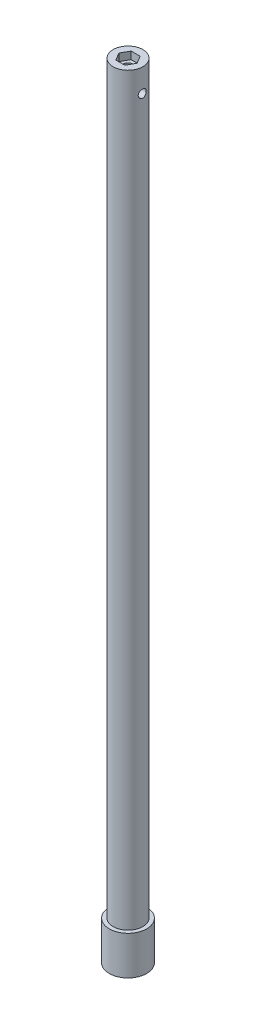
ISO-10303-21;
HEADER;
FILE_DESCRIPTION(('STEP AP214'),'2;1');
FILE_NAME('part.step','',(''),(''),'','','');
FILE_SCHEMA(('AUTOMOTIVE_DESIGN { 1 0 10303 214 1 1 1 1 }'));
ENDSEC;
DATA;
#1=APPLICATION_CONTEXT('core data for automotive mechanical design processes');
#2=APPLICATION_PROTOCOL_DEFINITION('international standard','automotive_design',2000,#1);
#3=PRODUCT_CONTEXT('',#1,'mechanical');
#4=PRODUCT('Part','Part','',(#3));
#5=PRODUCT_RELATED_PRODUCT_CATEGORY('part','',(#4));
#6=PRODUCT_DEFINITION_FORMATION('','',#4);
#7=PRODUCT_DEFINITION_CONTEXT('part definition',#1,'design');
#8=PRODUCT_DEFINITION('design','',#6,#7);
#9=PRODUCT_DEFINITION_SHAPE('','',#8);
#10=(LENGTH_UNIT() NAMED_UNIT(*) SI_UNIT(.MILLI.,.METRE.));
#11=(NAMED_UNIT(*) PLANE_ANGLE_UNIT() SI_UNIT($,.RADIAN.));
#12=(NAMED_UNIT(*) SI_UNIT($,.STERADIAN.) SOLID_ANGLE_UNIT());
#13=UNCERTAINTY_MEASURE_WITH_UNIT(LENGTH_MEASURE(1.E-05),#10,'distance_accuracy_value','');
#14=(GEOMETRIC_REPRESENTATION_CONTEXT(3) GLOBAL_UNCERTAINTY_ASSIGNED_CONTEXT((#13)) GLOBAL_UNIT_ASSIGNED_CONTEXT((#10,
#11,#12)) REPRESENTATION_CONTEXT('',''));
#15=CARTESIAN_POINT('',(0.,0.,0.));
#16=DIRECTION('',(0.,0.,1.));
#17=DIRECTION('',(1.,0.,0.));
#18=AXIS2_PLACEMENT_3D('',#15,#16,#17);
#19=CARTESIAN_POINT('',(0.,-94.4,0.));
#20=DIRECTION('',(0.,1.,0.));
#21=DIRECTION('',(0.,0.,1.));
#22=AXIS2_PLACEMENT_3D('',#19,#20,#21);
#23=CYLINDRICAL_SURFACE('',#22,3.975);
#24=CARTESIAN_POINT('',(-3.82187107464893,98.55,1.09266943251919));
#25=CARTESIAN_POINT('',(-3.82187209199229,98.4914162788504,1.09266803786974));
#26=CARTESIAN_POINT('',(-3.82326798429133,98.4328178949471,1.08781892201563));
#27=CARTESIAN_POINT('',(-3.82868614110019,98.3173164697365,1.06858968017087));
#28=CARTESIAN_POINT('',(-3.8327097137592,98.2604142876179,1.05420480690019));
#29=CARTESIAN_POINT('',(-3.84290269338876,98.1499951526496,1.0164168835325));
#30=CARTESIAN_POINT('',(-3.84906894094026,98.0964733519195,0.99302710590454));
#31=CARTESIAN_POINT('',(-3.86286188937835,97.9941062797117,0.937937126892454));
#32=CARTESIAN_POINT('',(-3.8704887148918,97.9452614078366,0.906236216258347));
#33=CARTESIAN_POINT('',(-3.88658781276219,97.8523411278052,0.834529228703212));
#34=CARTESIAN_POINT('',(-3.89507594467744,97.8084077568019,0.794342626401324));
#35=CARTESIAN_POINT('',(-3.91183663420667,97.7278120706256,0.707195247070373));
#36=CARTESIAN_POINT('',(-3.92010916697909,97.6911505901388,0.660233693462525));
#37=CARTESIAN_POINT('',(-3.93571274670838,97.6255069892398,0.559832996245872));
#38=CARTESIAN_POINT('',(-3.94302424371549,97.5966744157075,0.506292769659428));
#39=CARTESIAN_POINT('',(-3.95573255410012,97.5484756980969,0.394895918338448));
#40=CARTESIAN_POINT('',(-3.96112968597785,97.529107979112,0.337040013560119));
#41=CARTESIAN_POINT('',(-3.96932764169251,97.5008320065755,0.220049254522513));
#42=CARTESIAN_POINT('',(-3.97218484972497,97.4916953697049,0.160973626153633));
#43=CARTESIAN_POINT('',(-3.97522204334284,97.4834315721047,0.0420625207204664));
#44=CARTESIAN_POINT('',(-3.97540250524426,97.4843026304979,-0.0177728192595772));
#45=CARTESIAN_POINT('',(-3.97313330971671,97.4958690521729,-0.134807485568965));
#46=CARTESIAN_POINT('',(-3.97075391555135,97.506300853746,-0.192034501410154));
#47=CARTESIAN_POINT('',(-3.96376214042357,97.5362751965566,-0.303903960560501));
#48=CARTESIAN_POINT('',(-3.95914965008334,97.5558181840612,-0.358546277126297));
#49=CARTESIAN_POINT('',(-3.94815904121229,97.6036136638061,-0.464235288519605));
#50=CARTESIAN_POINT('',(-3.94176648431642,97.631937602044,-0.515248104810149));
#51=CARTESIAN_POINT('',(-3.92792666726424,97.6964362120861,-0.611885295394608));
#52=CARTESIAN_POINT('',(-3.92047920643327,97.7326123783206,-0.657508641412578));
#53=CARTESIAN_POINT('',(-3.90509352182671,97.8130828276092,-0.743531452316651));
#54=CARTESIAN_POINT('',(-3.8971472640197,97.8575900812495,-0.783730471300926));
#55=CARTESIAN_POINT('',(-3.88188196894926,97.9527838896013,-0.856148851671213));
#56=CARTESIAN_POINT('',(-3.87456297323479,98.0034708531105,-0.888367684727439));
#57=CARTESIAN_POINT('',(-3.8613631469357,98.1100825062457,-0.944102550252591));
#58=CARTESIAN_POINT('',(-3.85549313333103,98.1660425214158,-0.967553760792596));
#59=CARTESIAN_POINT('',(-3.84599387089196,98.2813010953118,-1.00465260086728));
#60=CARTESIAN_POINT('',(-3.84236409489714,98.340598865029,-1.01830253690771));
#61=CARTESIAN_POINT('',(-3.83787889893984,98.4590520574725,-1.03507701407277));
#62=CARTESIAN_POINT('',(-3.83694787528522,98.5181640220469,-1.038488478366));
#63=CARTESIAN_POINT('',(-3.8377606395132,98.6361144207582,-1.03548095996387));
#64=CARTESIAN_POINT('',(-3.83950415086026,98.6949528825432,-1.02906299358993));
#65=CARTESIAN_POINT('',(-3.8453909638,98.8095502459127,-1.00683662065716));
#66=CARTESIAN_POINT('',(-3.84948888567133,98.8653461221263,-0.991205645322709));
#67=CARTESIAN_POINT('',(-3.85956901043962,98.9735250334129,-0.951196567905948));
#68=CARTESIAN_POINT('',(-3.86555145448478,99.0259076306782,-0.926817346320403));
#69=CARTESIAN_POINT('',(-3.87887023170185,99.1269948966345,-0.869410085996329));
#70=CARTESIAN_POINT('',(-3.88623249829728,99.175598480361,-0.836210204864166));
#71=CARTESIAN_POINT('',(-3.90140019800979,99.2666532414204,-0.76231317218025));
#72=CARTESIAN_POINT('',(-3.9092057109323,99.309103305908,-0.721614667540028));
#73=CARTESIAN_POINT('',(-3.92461612446316,99.387840203461,-0.632540688105606));
#74=CARTESIAN_POINT('',(-3.93220966134676,99.4239262012227,-0.583985359510308));
#75=CARTESIAN_POINT('',(-3.94608945317998,99.4874344852381,-0.481332932504472));
#76=CARTESIAN_POINT('',(-3.95237578882713,99.5148573063505,-0.42723617649112));
#77=CARTESIAN_POINT('',(-3.96285480423359,99.5599872405455,-0.315478401581338));
#78=CARTESIAN_POINT('',(-3.96706499916649,99.5777757625984,-0.257851979013135));
#79=CARTESIAN_POINT('',(-3.97295840742469,99.6033879236337,-0.140304152484637));
#80=CARTESIAN_POINT('',(-3.97464217304092,99.61121374046,-0.0803832530473311));
#81=CARTESIAN_POINT('',(-3.97524562613339,99.6165491193042,0.0381082496667227));
#82=CARTESIAN_POINT('',(-3.97424732553574,99.6143633625447,0.0966649198606771));
#83=CARTESIAN_POINT('',(-3.96973768206914,99.6004549578451,0.212531132899227));
#84=CARTESIAN_POINT('',(-3.96622641302525,99.5887325900668,0.269840712329432));
#85=CARTESIAN_POINT('',(-3.957062499867,99.5562398661086,0.381306629395991));
#86=CARTESIAN_POINT('',(-3.9514215013898,99.535518625948,0.435478299921873));
#87=CARTESIAN_POINT('',(-3.93855442787458,99.4856730219225,0.539601100562214));
#88=CARTESIAN_POINT('',(-3.93132811792256,99.4565474124828,0.589551603656217));
#89=CARTESIAN_POINT('',(-3.91578454423047,99.3897677051413,0.685330664046473));
#90=CARTESIAN_POINT('',(-3.90744238645229,99.3518975157907,0.731004516985065));
#91=CARTESIAN_POINT('',(-3.89069669921392,99.2691117118122,0.815451690860182));
#92=CARTESIAN_POINT('',(-3.88229315397127,99.2241942198748,0.854223167201935));
#93=CARTESIAN_POINT('',(-3.86614251895489,99.1273931988594,0.924609422086886));
#94=CARTESIAN_POINT('',(-3.85841395826089,99.0753780610649,0.956047817386074));
#95=CARTESIAN_POINT('',(-3.84472843872933,98.9665895643412,1.00968289191211));
#96=CARTESIAN_POINT('',(-3.83877030217457,98.9098194009081,1.03188571875019));
#97=CARTESIAN_POINT('',(-3.8301188923422,98.802716941933,1.06350152399727));
#98=CARTESIAN_POINT('',(-3.82705078461277,98.7528524523617,1.07441338680586));
#99=CARTESIAN_POINT('',(-3.82292655588827,98.6519955873326,1.08899750566838));
#100=CARTESIAN_POINT('',(-3.8218701889435,98.6010033505211,1.09267064670965));
#101=CARTESIAN_POINT('',(-3.82187107464893,98.55,1.09266943251919));
#102=B_SPLINE_CURVE_WITH_KNOTS('',3,(#24,#25,#26,#27,#28,#29,#30,#31,#32,#33,#34,#35,#36,#37,
#38,#39,#40,#41,#42,#43,#44,#45,#46,#47,#48,#49,#50,#51,#52,#53,#54,#55,#56,#57,#58,#59,#60,#61,
#62,#63,#64,#65,#66,#67,#68,#69,#70,#71,#72,#73,#74,#75,#76,#77,#78,#79,#80,#81,#82,#83,#84,#85,
#86,#87,#88,#89,#90,#91,#92,#93,#94,#95,#96,#97,#98,#99,#100,#101),.UNSPECIFIED.,.T.,.F.,(4,2,2,
2,2,2,2,2,2,2,2,2,2,2,2,2,2,2,2,2,2,2,2,2,2,2,2,2,2,2,2,2,2,2,2,2,2,2,4),(0.,0.175563331327351,
0.351214130782236,0.526607020857927,0.702014883370913,0.881618605289015,1.06124293066495,
1.24408931498578,1.42690526417279,1.60555347509996,1.78416989592871,1.95800582572313,
2.13185027092151,2.30714806376194,2.48247924844865,2.66312902360155,2.8437907555136,
3.02576293752994,3.20769228250857,3.3844732771787,3.561235994678,3.73470085396203,
3.9081879192698,4.08534025724529,4.26252459282123,4.44456571909443,4.62659560407359,
4.80706235412474,4.98748964742997,5.16246312801359,5.33743146850182,5.5114565999033,
5.68550753606568,5.86443513495771,6.04341047901093,6.2263267234384,6.40912101495867,
6.56198622877788,6.71483275253293),.UNSPECIFIED.);
#103=CARTESIAN_POINT('',(-3.82187107464893,98.55,1.09266943251919));
#104=VERTEX_POINT('',#103);
#105=EDGE_CURVE('E286',#104,#104,#102,.T.);
#106=ORIENTED_EDGE('',*,*,#105,.T.);
#107=EDGE_LOOP('',(#106));
#108=FACE_BOUND('',#107,.T.);
#109=CARTESIAN_POINT('',(0.,-94.4,0.));
#110=DIRECTION('',(0.,1.,0.));
#111=DIRECTION('',(0.,0.,1.));
#112=AXIS2_PLACEMENT_3D('',#109,#110,#111);
#113=CIRCLE('',#112,3.975);
#114=CARTESIAN_POINT('',(0.,-94.4,3.975));
#115=VERTEX_POINT('',#114);
#116=EDGE_CURVE('E277',#115,#115,#113,.T.);
#117=ORIENTED_EDGE('',*,*,#116,.T.);
#118=EDGE_LOOP('',(#117));
#119=FACE_BOUND('',#118,.T.);
#120=CARTESIAN_POINT('',(0.,104.75,0.));
#121=DIRECTION('',(0.,1.,0.));
#122=DIRECTION('',(0.,0.,1.));
#123=AXIS2_PLACEMENT_3D('',#120,#121,#122);
#124=CIRCLE('',#123,3.975);
#125=CARTESIAN_POINT('',(0.,104.75,3.975));
#126=VERTEX_POINT('',#125);
#127=EDGE_CURVE('E262',#126,#126,#124,.T.);
#128=ORIENTED_EDGE('',*,*,#127,.F.);
#129=EDGE_LOOP('',(#128));
#130=FACE_BOUND('',#129,.T.);
#131=CARTESIAN_POINT('',(3.82187107464893,98.55,1.09266943251919));
#132=CARTESIAN_POINT('',(3.82187209199229,98.6085837211496,1.09266803786974));
#133=CARTESIAN_POINT('',(3.82326798429133,98.6671821050529,1.08781892201563));
#134=CARTESIAN_POINT('',(3.82868614110019,98.7826835302635,1.06858968017087));
#135=CARTESIAN_POINT('',(3.8327097137592,98.8395857123821,1.05420480690018));
#136=CARTESIAN_POINT('',(3.84290269338876,98.9500048473504,1.0164168835325));
#137=CARTESIAN_POINT('',(3.84906894094026,99.0035266480805,0.993027105904537));
#138=CARTESIAN_POINT('',(3.86286188937835,99.1058937202883,0.93793712689245));
#139=CARTESIAN_POINT('',(3.87048871489181,99.1547385921634,0.906236216258344));
#140=CARTESIAN_POINT('',(3.88658781276219,99.2476588721948,0.834529228703211));
#141=CARTESIAN_POINT('',(3.89507594467744,99.2915922431981,0.794342626401323));
#142=CARTESIAN_POINT('',(3.91183663420667,99.3721879293744,0.707195247070373));
#143=CARTESIAN_POINT('',(3.92010916697909,99.4088494098611,0.660233693462525));
#144=CARTESIAN_POINT('',(3.93571274670838,99.4744930107602,0.559832996245872));
#145=CARTESIAN_POINT('',(3.94302424371549,99.5033255842926,0.506292769659428));
#146=CARTESIAN_POINT('',(3.95573255410012,99.5515243019031,0.394895918338448));
#147=CARTESIAN_POINT('',(3.96112968597785,99.570892020888,0.337040013560118));
#148=CARTESIAN_POINT('',(3.96932764169251,99.5991679934244,0.220049254522514));
#149=CARTESIAN_POINT('',(3.97218484972497,99.6083046302951,0.160973626153635));
#150=CARTESIAN_POINT('',(3.97522204334284,99.6165684278953,0.0420625207204677));
#151=CARTESIAN_POINT('',(3.97540250524426,99.6156973695021,-0.0177728192595766));
#152=CARTESIAN_POINT('',(3.97313330971671,99.6041309478271,-0.134807485568965));
#153=CARTESIAN_POINT('',(3.97075391555135,99.593699146254,-0.192034501410154));
#154=CARTESIAN_POINT('',(3.96376214042357,99.5637248034434,-0.303903960560501));
#155=CARTESIAN_POINT('',(3.95914965008334,99.5441818159388,-0.358546277126297));
#156=CARTESIAN_POINT('',(3.94815904121229,99.4963863361939,-0.464235288519605));
#157=CARTESIAN_POINT('',(3.94176648431642,99.468062397956,-0.515248104810149));
#158=CARTESIAN_POINT('',(3.92792666726424,99.4035637879139,-0.611885295394608));
#159=CARTESIAN_POINT('',(3.92047920643327,99.3673876216794,-0.657508641412578));
#160=CARTESIAN_POINT('',(3.90509352182671,99.2869171723908,-0.743531452316654));
#161=CARTESIAN_POINT('',(3.8971472640197,99.2424099187505,-0.78373047130093));
#162=CARTESIAN_POINT('',(3.88188196894926,99.1472161103986,-0.856148851671216));
#163=CARTESIAN_POINT('',(3.87456297323479,99.0965291468895,-0.88836768472744));
#164=CARTESIAN_POINT('',(3.8613631469357,98.9899174937543,-0.944102550252592));
#165=CARTESIAN_POINT('',(3.85549313333103,98.9339574785842,-0.967553760792597));
#166=CARTESIAN_POINT('',(3.84599387089196,98.8186989046882,-1.00465260086728));
#167=CARTESIAN_POINT('',(3.84236409489714,98.759401134971,-1.01830253690771));
#168=CARTESIAN_POINT('',(3.83787889893984,98.6409479425275,-1.03507701407277));
#169=CARTESIAN_POINT('',(3.83694787528522,98.5818359779531,-1.038488478366));
#170=CARTESIAN_POINT('',(3.8377606395132,98.4638855792418,-1.03548095996387));
#171=CARTESIAN_POINT('',(3.83950415086026,98.4050471174567,-1.02906299358993));
#172=CARTESIAN_POINT('',(3.8453909638,98.2904497540873,-1.00683662065716));
#173=CARTESIAN_POINT('',(3.84948888567133,98.2346538778737,-0.991205645322714));
#174=CARTESIAN_POINT('',(3.85956901043962,98.1264749665871,-0.951196567905952));
#175=CARTESIAN_POINT('',(3.86555145448478,98.0740923693218,-0.926817346320404));
#176=CARTESIAN_POINT('',(3.87887023170185,97.9730051033655,-0.869410085996328));
#177=CARTESIAN_POINT('',(3.88623249829728,97.924401519639,-0.836210204864166));
#178=CARTESIAN_POINT('',(3.90140019800979,97.8333467585796,-0.76231317218025));
#179=CARTESIAN_POINT('',(3.9092057109323,97.790896694092,-0.721614667540028));
#180=CARTESIAN_POINT('',(3.92461612446316,97.712159796539,-0.632540688105606));
#181=CARTESIAN_POINT('',(3.93220966134676,97.6760737987773,-0.583985359510308));
#182=CARTESIAN_POINT('',(3.94608945317998,97.6125655147619,-0.481332932504472));
#183=CARTESIAN_POINT('',(3.95237578882713,97.5851426936495,-0.42723617649112));
#184=CARTESIAN_POINT('',(3.96285480423359,97.5400127594545,-0.315478401581338));
#185=CARTESIAN_POINT('',(3.96706499916649,97.5222242374016,-0.257851979013135));
#186=CARTESIAN_POINT('',(3.97295840742469,97.4966120763663,-0.140304152484637));
#187=CARTESIAN_POINT('',(3.97464217304092,97.48878625954,-0.0803832530473312));
#188=CARTESIAN_POINT('',(3.97524562613339,97.4834508806958,0.0381082496667233));
#189=CARTESIAN_POINT('',(3.97424732553574,97.4856366374553,0.0966649198606783));
#190=CARTESIAN_POINT('',(3.96973768206914,97.4995450421549,0.212531132899227));
#191=CARTESIAN_POINT('',(3.96622641302525,97.5112674099332,0.269840712329432));
#192=CARTESIAN_POINT('',(3.95706249986699,97.5437601338914,0.381306629395995));
#193=CARTESIAN_POINT('',(3.9514215013898,97.564481374052,0.435478299921881));
#194=CARTESIAN_POINT('',(3.93855442787458,97.6143269780775,0.539601100562222));
#195=CARTESIAN_POINT('',(3.93132811792256,97.6434525875172,0.58955160365622));
#196=CARTESIAN_POINT('',(3.91578454423047,97.7102322948587,0.685330664046472));
#197=CARTESIAN_POINT('',(3.90744238645229,97.7481024842093,0.731004516985065));
#198=CARTESIAN_POINT('',(3.89069669921392,97.8308882881878,0.815451690860182));
#199=CARTESIAN_POINT('',(3.88229315397127,97.8758057801252,0.854223167201935));
#200=CARTESIAN_POINT('',(3.86614251895489,97.9726068011406,0.924609422086886));
#201=CARTESIAN_POINT('',(3.85841395826089,98.0246219389351,0.956047817386074));
#202=CARTESIAN_POINT('',(3.84472843872933,98.1334104356588,1.00968289191211));
#203=CARTESIAN_POINT('',(3.83877030217457,98.1901805990919,1.03188571875019));
#204=CARTESIAN_POINT('',(3.8301188923422,98.297283058067,1.06350152399727));
#205=CARTESIAN_POINT('',(3.82705078461277,98.3471475476383,1.07441338680586));
#206=CARTESIAN_POINT('',(3.82292655588827,98.4480044126674,1.08899750566838));
#207=CARTESIAN_POINT('',(3.8218701889435,98.4989966494789,1.09267064670965));
#208=CARTESIAN_POINT('',(3.82187107464893,98.55,1.09266943251919));
#209=B_SPLINE_CURVE_WITH_KNOTS('',3,(#131,#132,#133,#134,#135,#136,#137,#138,#139,#140,#141,
#142,#143,#144,#145,#146,#147,#148,#149,#150,#151,#152,#153,#154,#155,#156,#157,#158,#159,#160,
#161,#162,#163,#164,#165,#166,#167,#168,#169,#170,#171,#172,#173,#174,#175,#176,#177,#178,#179,
#180,#181,#182,#183,#184,#185,#186,#187,#188,#189,#190,#191,#192,#193,#194,#195,#196,#197,#198,
#199,#200,#201,#202,#203,#204,#205,#206,#207,#208),.UNSPECIFIED.,.T.,.F.,(4,2,2,2,2,2,2,2,2,2,2,
2,2,2,2,2,2,2,2,2,2,2,2,2,2,2,2,2,2,2,2,2,2,2,2,2,2,2,4),(0.,0.175563331327351,
0.351214130782236,0.526607020857942,0.702014883370913,0.881618605289015,1.06124293066495,
1.24408931498578,1.42690526417279,1.60555347509996,1.78416989592871,1.95800582572313,
2.13185027092151,2.30714806376194,2.48247924844865,2.66312902360157,2.8437907555136,
3.02576293752994,3.20769228250857,3.3844732771787,3.561235994678,3.73470085396203,
3.9081879192698,4.08534025724529,4.26252459282123,4.44456571909443,4.62659560407359,
4.80706235412474,4.98748964742997,5.1624631280136,5.33743146850182,5.51145659990331,
5.68550753606569,5.86443513495771,6.04341047901093,6.22632672343841,6.40912101495867,
6.56198622877788,6.71483275253294),.UNSPECIFIED.);
#210=CARTESIAN_POINT('',(3.82187107464893,98.55,1.09266943251919));
#211=VERTEX_POINT('',#210);
#212=EDGE_CURVE('E43',#211,#211,#209,.T.);
#213=ORIENTED_EDGE('',*,*,#212,.T.);
#214=EDGE_LOOP('',(#213));
#215=FACE_BOUND('',#214,.T.);
#216=ADVANCED_FACE('F39',(#108,#119,#130,#215),#23,.T.);
#217=CARTESIAN_POINT('',(0.,104.75,0.));
#218=DIRECTION('',(0.,-1.,0.));
#219=DIRECTION('',(0.,0.,-1.));
#220=AXIS2_PLACEMENT_3D('',#217,#218,#219);
#221=CYLINDRICAL_SURFACE('',#220,5.);
#222=CARTESIAN_POINT('',(0.,-104.75,0.));
#223=DIRECTION('',(0.,1.,0.));
#224=DIRECTION('',(0.,0.,1.));
#225=AXIS2_PLACEMENT_3D('',#222,#223,#224);
#226=CIRCLE('',#225,5.);
#227=CARTESIAN_POINT('',(0.,-104.75,5.));
#228=VERTEX_POINT('',#227);
#229=EDGE_CURVE('E11',#228,#228,#226,.T.);
#230=ORIENTED_EDGE('',*,*,#229,.T.);
#231=EDGE_LOOP('',(#230));
#232=FACE_BOUND('',#231,.T.);
#233=CARTESIAN_POINT('',(0.,-94.4,0.));
#234=DIRECTION('',(0.,1.,0.));
#235=DIRECTION('',(0.,0.,1.));
#236=AXIS2_PLACEMENT_3D('',#233,#234,#235);
#237=CIRCLE('',#236,5.);
#238=CARTESIAN_POINT('',(0.,-94.4,5.));
#239=VERTEX_POINT('',#238);
#240=EDGE_CURVE('E54',#239,#239,#237,.T.);
#241=ORIENTED_EDGE('',*,*,#240,.F.);
#242=EDGE_LOOP('',(#241));
#243=FACE_BOUND('',#242,.T.);
#244=ADVANCED_FACE('F41',(#232,#243),#221,.T.);
#245=CARTESIAN_POINT('',(0.,-104.75,0.));
#246=DIRECTION('',(0.,1.,0.));
#247=DIRECTION('',(0.,0.,1.));
#248=AXIS2_PLACEMENT_3D('',#245,#246,#247);
#249=PLANE('',#248);
#250=DIRECTION('',(-0.866025403784439,0.,-0.5));
#251=VECTOR('',#250,1.);
#252=CARTESIAN_POINT('',(0.,-104.75,2.39600361713695));
#253=LINE('',#252,#251);
#254=CARTESIAN_POINT('',(0.,-104.75,2.39600361713695));
#255=VERTEX_POINT('',#254);
#256=CARTESIAN_POINT('',(-2.075,-104.75,1.19800180856847));
#257=VERTEX_POINT('',#256);
#258=EDGE_CURVE('E183',#255,#257,#253,.T.);
#259=ORIENTED_EDGE('',*,*,#258,.F.);
#260=DIRECTION('',(-0.866025403784439,0.,0.5));
#261=VECTOR('',#260,1.);
#262=CARTESIAN_POINT('',(2.075,-104.75,1.19800180856847));
#263=LINE('',#262,#261);
#264=CARTESIAN_POINT('',(2.075,-104.75,1.19800180856847));
#265=VERTEX_POINT('',#264);
#266=EDGE_CURVE('E62',#265,#255,#263,.T.);
#267=ORIENTED_EDGE('',*,*,#266,.F.);
#268=DIRECTION('',(0.,0.,1.));
#269=VECTOR('',#268,1.);
#270=CARTESIAN_POINT('',(2.075,-104.75,-1.19800180856847));
#271=LINE('',#270,#269);
#272=CARTESIAN_POINT('',(2.075,-104.75,-1.19800180856847));
#273=VERTEX_POINT('',#272);
#274=EDGE_CURVE('E160',#273,#265,#271,.T.);
#275=ORIENTED_EDGE('',*,*,#274,.F.);
#276=DIRECTION('',(0.866025403784439,0.,0.5));
#277=VECTOR('',#276,1.);
#278=CARTESIAN_POINT('',(0.,-104.75,-2.39600361713695));
#279=LINE('',#278,#277);
#280=CARTESIAN_POINT('',(0.,-104.75,-2.39600361713695));
#281=VERTEX_POINT('',#280);
#282=EDGE_CURVE('E164',#281,#273,#279,.T.);
#283=ORIENTED_EDGE('',*,*,#282,.F.);
#284=DIRECTION('',(0.866025403784439,0.,-0.5));
#285=VECTOR('',#284,1.);
#286=CARTESIAN_POINT('',(-2.075,-104.75,-1.19800180856847));
#287=LINE('',#286,#285);
#288=CARTESIAN_POINT('',(-2.075,-104.75,-1.19800180856847));
#289=VERTEX_POINT('',#288);
#290=EDGE_CURVE('E191',#289,#281,#287,.T.);
#291=ORIENTED_EDGE('',*,*,#290,.F.);
#292=DIRECTION('',(0.,0.,-1.));
#293=VECTOR('',#292,1.);
#294=CARTESIAN_POINT('',(-2.075,-104.75,1.19800180856847));
#295=LINE('',#294,#293);
#296=EDGE_CURVE('E187',#257,#289,#295,.T.);
#297=ORIENTED_EDGE('',*,*,#296,.F.);
#298=EDGE_LOOP('',(#259,#267,#275,#283,#291,#297));
#299=FACE_BOUND('',#298,.T.);
#300=ORIENTED_EDGE('',*,*,#229,.F.);
#301=EDGE_LOOP('',(#300));
#302=FACE_BOUND('',#301,.T.);
#303=ADVANCED_FACE('F377',(#299,#302),#249,.F.);
#304=CARTESIAN_POINT('',(0.,-94.4,0.));
#305=DIRECTION('',(0.,1.,0.));
#306=DIRECTION('',(0.,0.,1.));
#307=AXIS2_PLACEMENT_3D('',#304,#305,#306);
#308=PLANE('',#307);
#309=ORIENTED_EDGE('',*,*,#116,.F.);
#310=EDGE_LOOP('',(#309));
#311=FACE_BOUND('',#310,.T.);
#312=ORIENTED_EDGE('',*,*,#240,.T.);
#313=EDGE_LOOP('',(#312));
#314=FACE_BOUND('',#313,.T.);
#315=ADVANCED_FACE('F369',(#311,#314),#308,.T.);
#316=CARTESIAN_POINT('',(0.,104.75,0.));
#317=DIRECTION('',(0.,1.,0.));
#318=DIRECTION('',(0.,0.,1.));
#319=AXIS2_PLACEMENT_3D('',#316,#317,#318);
#320=PLANE('',#319);
#321=DIRECTION('',(-0.50996765859573,0.,-0.860193575415667));
#322=VECTOR('',#321,1.);
#323=CARTESIAN_POINT('',(2.39584384629662,104.75,-0.0276694325191907));
#324=LINE('',#323,#322);
#325=CARTESIAN_POINT('',(2.39584384629662,104.75,-0.0276694325191907));
#326=VERTEX_POINT('',#325);
#327=CARTESIAN_POINT('',(1.17395949167839,104.75,-2.08869635065309));
#328=VERTEX_POINT('',#327);
#329=EDGE_CURVE('E70',#326,#328,#324,.T.);
#330=ORIENTED_EDGE('',*,*,#329,.F.);
#331=DIRECTION('',(0.489965659184267,0.,-0.871741735160206));
#332=VECTOR('',#331,1.);
#333=CARTESIAN_POINT('',(1.22188435461823,104.75,2.0610269181339));
#334=LINE('',#333,#332);
#335=CARTESIAN_POINT('',(1.22188435461823,104.75,2.0610269181339));
#336=VERTEX_POINT('',#335);
#337=EDGE_CURVE('E217',#336,#326,#334,.T.);
#338=ORIENTED_EDGE('',*,*,#337,.F.);
#339=DIRECTION('',(0.999933317779998,0.,-0.011548159744539));
#340=VECTOR('',#339,1.);
#341=CARTESIAN_POINT('',(-1.17395949167839,104.75,2.08869635065309));
#342=LINE('',#341,#340);
#343=CARTESIAN_POINT('',(-1.17395949167839,104.75,2.08869635065309));
#344=VERTEX_POINT('',#343);
#345=EDGE_CURVE('E252',#344,#336,#342,.T.);
#346=ORIENTED_EDGE('',*,*,#345,.F.);
#347=DIRECTION('',(0.509967658595731,0.,0.860193575415667));
#348=VECTOR('',#347,1.);
#349=CARTESIAN_POINT('',(-2.39584384629662,104.75,0.027669432519191));
#350=LINE('',#349,#348);
#351=CARTESIAN_POINT('',(-2.39584384629662,104.75,0.027669432519191));
#352=VERTEX_POINT('',#351);
#353=EDGE_CURVE('E248',#352,#344,#350,.T.);
#354=ORIENTED_EDGE('',*,*,#353,.F.);
#355=DIRECTION('',(-0.489965659184267,0.,0.871741735160206));
#356=VECTOR('',#355,1.);
#357=CARTESIAN_POINT('',(-1.22188435461823,104.75,-2.0610269181339));
#358=LINE('',#357,#356);
#359=CARTESIAN_POINT('',(-1.22188435461823,104.75,-2.0610269181339));
#360=VERTEX_POINT('',#359);
#361=EDGE_CURVE('E244',#360,#352,#358,.T.);
#362=ORIENTED_EDGE('',*,*,#361,.F.);
#363=DIRECTION('',(-0.999933317779998,0.,0.011548159744539));
#364=VECTOR('',#363,1.);
#365=CARTESIAN_POINT('',(1.17395949167839,104.75,-2.08869635065309));
#366=LINE('',#365,#364);
#367=EDGE_CURVE('E240',#328,#360,#366,.T.);
#368=ORIENTED_EDGE('',*,*,#367,.F.);
#369=EDGE_LOOP('',(#330,#338,#346,#354,#362,#368));
#370=FACE_BOUND('',#369,.T.);
#371=ORIENTED_EDGE('',*,*,#127,.T.);
#372=EDGE_LOOP('',(#371));
#373=FACE_BOUND('',#372,.T.);
#374=ADVANCED_FACE('F365',(#370,#373),#320,.T.);
#375=CARTESIAN_POINT('',(2.39584384629662,102.75,-0.0276694325191907));
#376=DIRECTION('',(0.860193575415667,0.,-0.50996765859573));
#377=DIRECTION('',(-0.509967658595731,0.,-0.860193575415667));
#378=AXIS2_PLACEMENT_3D('',#375,#376,#377);
#379=PLANE('',#378);
#380=ORIENTED_EDGE('',*,*,#329,.T.);
#381=DIRECTION('',(0.,1.,0.));
#382=VECTOR('',#381,1.);
#383=CARTESIAN_POINT('',(1.17395949167839,102.75,-2.08869635065309));
#384=LINE('',#383,#382);
#385=CARTESIAN_POINT('',(1.17395949167839,102.75,-2.08869635065309));
#386=VERTEX_POINT('',#385);
#387=EDGE_CURVE('E237',#386,#328,#384,.T.);
#388=ORIENTED_EDGE('',*,*,#387,.F.);
#389=DIRECTION('',(-0.50996765859573,0.,-0.860193575415667));
#390=VECTOR('',#389,1.);
#391=CARTESIAN_POINT('',(2.39584384629662,102.75,-0.0276694325191907));
#392=LINE('',#391,#390);
#393=CARTESIAN_POINT('',(2.39584384629662,102.75,-0.0276694325191907));
#394=VERTEX_POINT('',#393);
#395=EDGE_CURVE('E212',#394,#386,#392,.T.);
#396=ORIENTED_EDGE('',*,*,#395,.F.);
#397=DIRECTION('',(0.,1.,0.));
#398=VECTOR('',#397,1.);
#399=CARTESIAN_POINT('',(2.39584384629662,102.75,-0.0276694325191907));
#400=LINE('',#399,#398);
#401=EDGE_CURVE('E259',#394,#326,#400,.T.);
#402=ORIENTED_EDGE('',*,*,#401,.T.);
#403=EDGE_LOOP('',(#380,#388,#396,#402));
#404=FACE_BOUND('',#403,.T.);
#405=ADVANCED_FACE('F349',(#404),#379,.F.);
#406=CARTESIAN_POINT('',(1.22188435461823,102.75,2.0610269181339));
#407=DIRECTION('',(0.871741735160206,0.,0.489965659184267));
#408=DIRECTION('',(0.489965659184267,0.,-0.871741735160206));
#409=AXIS2_PLACEMENT_3D('',#406,#407,#408);
#410=PLANE('',#409);
#411=ORIENTED_EDGE('',*,*,#337,.T.);
#412=ORIENTED_EDGE('',*,*,#401,.F.);
#413=DIRECTION('',(0.489965659184267,0.,-0.871741735160206));
#414=VECTOR('',#413,1.);
#415=CARTESIAN_POINT('',(1.22188435461823,102.75,2.0610269181339));
#416=LINE('',#415,#414);
#417=CARTESIAN_POINT('',(1.22188435461823,102.75,2.0610269181339));
#418=VERTEX_POINT('',#417);
#419=EDGE_CURVE('E233',#418,#394,#416,.T.);
#420=ORIENTED_EDGE('',*,*,#419,.F.);
#421=DIRECTION('',(0.,1.,0.));
#422=VECTOR('',#421,1.);
#423=CARTESIAN_POINT('',(1.22188435461823,102.75,2.0610269181339));
#424=LINE('',#423,#422);
#425=EDGE_CURVE('E263',#418,#336,#424,.T.);
#426=ORIENTED_EDGE('',*,*,#425,.T.);
#427=EDGE_LOOP('',(#411,#412,#420,#426));
#428=FACE_BOUND('',#427,.T.);
#429=ADVANCED_FACE('F345',(#428),#410,.F.);
#430=CARTESIAN_POINT('',(-1.17395949167839,102.75,2.08869635065309));
#431=DIRECTION('',(0.011548159744539,0.,0.999933317779998));
#432=DIRECTION('',(0.999933317779998,0.,-0.011548159744539));
#433=AXIS2_PLACEMENT_3D('',#430,#431,#432);
#434=PLANE('',#433);
#435=ORIENTED_EDGE('',*,*,#345,.T.);
#436=ORIENTED_EDGE('',*,*,#425,.F.);
#437=DIRECTION('',(0.999933317779998,0.,-0.011548159744539));
#438=VECTOR('',#437,1.);
#439=CARTESIAN_POINT('',(-1.17395949167839,102.75,2.08869635065309));
#440=LINE('',#439,#438);
#441=CARTESIAN_POINT('',(-1.17395949167839,102.75,2.08869635065309));
#442=VERTEX_POINT('',#441);
#443=EDGE_CURVE('E229',#442,#418,#440,.T.);
#444=ORIENTED_EDGE('',*,*,#443,.F.);
#445=DIRECTION('',(0.,1.,0.));
#446=VECTOR('',#445,1.);
#447=CARTESIAN_POINT('',(-1.17395949167839,102.75,2.08869635065309));
#448=LINE('',#447,#446);
#449=EDGE_CURVE('E266',#442,#344,#448,.T.);
#450=ORIENTED_EDGE('',*,*,#449,.T.);
#451=EDGE_LOOP('',(#435,#436,#444,#450));
#452=FACE_BOUND('',#451,.T.);
#453=ADVANCED_FACE('F348',(#452),#434,.F.);
#454=CARTESIAN_POINT('',(-2.39584384629662,102.75,0.027669432519191));
#455=DIRECTION('',(-0.860193575415667,0.,0.509967658595731));
#456=DIRECTION('',(0.509967658595731,0.,0.860193575415667));
#457=AXIS2_PLACEMENT_3D('',#454,#455,#456);
#458=PLANE('',#457);
#459=ORIENTED_EDGE('',*,*,#353,.T.);
#460=ORIENTED_EDGE('',*,*,#449,.F.);
#461=DIRECTION('',(0.509967658595731,0.,0.860193575415667));
#462=VECTOR('',#461,1.);
#463=CARTESIAN_POINT('',(-2.39584384629662,102.75,0.027669432519191));
#464=LINE('',#463,#462);
#465=CARTESIAN_POINT('',(-2.39584384629662,102.75,0.027669432519191));
#466=VERTEX_POINT('',#465);
#467=EDGE_CURVE('E225',#466,#442,#464,.T.);
#468=ORIENTED_EDGE('',*,*,#467,.F.);
#469=DIRECTION('',(0.,1.,0.));
#470=VECTOR('',#469,1.);
#471=CARTESIAN_POINT('',(-2.39584384629662,102.75,0.027669432519191));
#472=LINE('',#471,#470);
#473=EDGE_CURVE('E269',#466,#352,#472,.T.);
#474=ORIENTED_EDGE('',*,*,#473,.T.);
#475=EDGE_LOOP('',(#459,#460,#468,#474));
#476=FACE_BOUND('',#475,.T.);
#477=ADVANCED_FACE('F353',(#476),#458,.F.);
#478=CARTESIAN_POINT('',(-1.22188435461823,102.75,-2.0610269181339));
#479=DIRECTION('',(-0.871741735160206,0.,-0.489965659184267));
#480=DIRECTION('',(-0.489965659184267,0.,0.871741735160206));
#481=AXIS2_PLACEMENT_3D('',#478,#479,#480);
#482=PLANE('',#481);
#483=ORIENTED_EDGE('',*,*,#361,.T.);
#484=ORIENTED_EDGE('',*,*,#473,.F.);
#485=DIRECTION('',(-0.489965659184267,0.,0.871741735160206));
#486=VECTOR('',#485,1.);
#487=CARTESIAN_POINT('',(-1.22188435461823,102.75,-2.0610269181339));
#488=LINE('',#487,#486);
#489=CARTESIAN_POINT('',(-1.22188435461823,102.75,-2.0610269181339));
#490=VERTEX_POINT('',#489);
#491=EDGE_CURVE('E221',#490,#466,#488,.T.);
#492=ORIENTED_EDGE('',*,*,#491,.F.);
#493=DIRECTION('',(0.,1.,0.));
#494=VECTOR('',#493,1.);
#495=CARTESIAN_POINT('',(-1.22188435461823,102.75,-2.0610269181339));
#496=LINE('',#495,#494);
#497=EDGE_CURVE('E272',#490,#360,#496,.T.);
#498=ORIENTED_EDGE('',*,*,#497,.T.);
#499=EDGE_LOOP('',(#483,#484,#492,#498));
#500=FACE_BOUND('',#499,.T.);
#501=ADVANCED_FACE('F357',(#500),#482,.F.);
#502=CARTESIAN_POINT('',(1.17395949167839,102.75,-2.08869635065309));
#503=DIRECTION('',(-0.011548159744539,0.,-0.999933317779998));
#504=DIRECTION('',(-0.999933317779998,0.,0.011548159744539));
#505=AXIS2_PLACEMENT_3D('',#502,#503,#504);
#506=PLANE('',#505);
#507=ORIENTED_EDGE('',*,*,#367,.T.);
#508=ORIENTED_EDGE('',*,*,#497,.F.);
#509=DIRECTION('',(-0.999933317779998,0.,0.011548159744539));
#510=VECTOR('',#509,1.);
#511=CARTESIAN_POINT('',(1.17395949167839,102.75,-2.08869635065309));
#512=LINE('',#511,#510);
#513=EDGE_CURVE('E216',#386,#490,#512,.T.);
#514=ORIENTED_EDGE('',*,*,#513,.F.);
#515=ORIENTED_EDGE('',*,*,#387,.T.);
#516=EDGE_LOOP('',(#507,#508,#514,#515));
#517=FACE_BOUND('',#516,.T.);
#518=ADVANCED_FACE('F343',(#517),#506,.F.);
#519=CARTESIAN_POINT('',(0.,102.75,0.));
#520=DIRECTION('',(0.,1.,0.));
#521=DIRECTION('',(0.,0.,1.));
#522=AXIS2_PLACEMENT_3D('',#519,#520,#521);
#523=PLANE('',#522);
#524=CARTESIAN_POINT('',(0.,102.75,0.));
#525=DIRECTION('',(0.,1.,0.));
#526=DIRECTION('',(0.,0.,1.));
#527=AXIS2_PLACEMENT_3D('',#524,#525,#526);
#528=CIRCLE('',#527,1.3);
#529=CARTESIAN_POINT('',(0.,102.75,1.3));
#530=VERTEX_POINT('',#529);
#531=EDGE_CURVE('E388',#530,#530,#528,.T.);
#532=ORIENTED_EDGE('',*,*,#531,.F.);
#533=EDGE_LOOP('',(#532));
#534=FACE_BOUND('',#533,.T.);
#535=ORIENTED_EDGE('',*,*,#395,.T.);
#536=ORIENTED_EDGE('',*,*,#513,.T.);
#537=ORIENTED_EDGE('',*,*,#491,.T.);
#538=ORIENTED_EDGE('',*,*,#467,.T.);
#539=ORIENTED_EDGE('',*,*,#443,.T.);
#540=ORIENTED_EDGE('',*,*,#419,.T.);
#541=EDGE_LOOP('',(#535,#536,#537,#538,#539,#540));
#542=FACE_BOUND('',#541,.T.);
#543=ADVANCED_FACE('F340',(#534,#542),#523,.T.);
#544=CARTESIAN_POINT('',(2.075,-102.75,1.19800180856847));
#545=DIRECTION('',(0.5,0.,0.866025403784439));
#546=DIRECTION('',(0.866025403784439,0.,-0.5));
#547=AXIS2_PLACEMENT_3D('',#544,#545,#546);
#548=PLANE('',#547);
#549=ORIENTED_EDGE('',*,*,#266,.T.);
#550=DIRECTION('',(0.,-1.,0.));
#551=VECTOR('',#550,1.);
#552=CARTESIAN_POINT('',(0.,-102.75,2.39600361713695));
#553=LINE('',#552,#551);
#554=CARTESIAN_POINT('',(0.,-102.75,2.39600361713695));
#555=VERTEX_POINT('',#554);
#556=EDGE_CURVE('E134',#555,#255,#553,.T.);
#557=ORIENTED_EDGE('',*,*,#556,.F.);
#558=DIRECTION('',(-0.866025403784439,0.,0.5));
#559=VECTOR('',#558,1.);
#560=CARTESIAN_POINT('',(2.075,-102.75,1.19800180856847));
#561=LINE('',#560,#559);
#562=CARTESIAN_POINT('',(2.075,-102.75,1.19800180856847));
#563=VERTEX_POINT('',#562);
#564=EDGE_CURVE('E138',#563,#555,#561,.T.);
#565=ORIENTED_EDGE('',*,*,#564,.F.);
#566=DIRECTION('',(0.,-1.,0.));
#567=VECTOR('',#566,1.);
#568=CARTESIAN_POINT('',(2.075,-102.75,1.19800180856847));
#569=LINE('',#568,#567);
#570=EDGE_CURVE('E198',#563,#265,#569,.T.);
#571=ORIENTED_EDGE('',*,*,#570,.T.);
#572=EDGE_LOOP('',(#549,#557,#565,#571));
#573=FACE_BOUND('',#572,.T.);
#574=ADVANCED_FACE('F136',(#573),#548,.F.);
#575=CARTESIAN_POINT('',(2.075,-102.75,-1.19800180856847));
#576=DIRECTION('',(1.,0.,0.));
#577=DIRECTION('',(0.,0.,-1.));
#578=AXIS2_PLACEMENT_3D('',#575,#576,#577);
#579=PLANE('',#578);
#580=ORIENTED_EDGE('',*,*,#274,.T.);
#581=ORIENTED_EDGE('',*,*,#570,.F.);
#582=DIRECTION('',(0.,0.,1.));
#583=VECTOR('',#582,1.);
#584=CARTESIAN_POINT('',(2.075,-102.75,-1.19800180856847));
#585=LINE('',#584,#583);
#586=CARTESIAN_POINT('',(2.075,-102.75,-1.19800180856847));
#587=VERTEX_POINT('',#586);
#588=EDGE_CURVE('E145',#587,#563,#585,.T.);
#589=ORIENTED_EDGE('',*,*,#588,.F.);
#590=DIRECTION('',(0.,-1.,0.));
#591=VECTOR('',#590,1.);
#592=CARTESIAN_POINT('',(2.075,-102.75,-1.19800180856847));
#593=LINE('',#592,#591);
#594=EDGE_CURVE('E201',#587,#273,#593,.T.);
#595=ORIENTED_EDGE('',*,*,#594,.T.);
#596=EDGE_LOOP('',(#580,#581,#589,#595));
#597=FACE_BOUND('',#596,.T.);
#598=ADVANCED_FACE('F320',(#597),#579,.F.);
#599=CARTESIAN_POINT('',(0.,-102.75,-2.39600361713695));
#600=DIRECTION('',(0.5,0.,-0.866025403784439));
#601=DIRECTION('',(-0.866025403784439,0.,-0.5));
#602=AXIS2_PLACEMENT_3D('',#599,#600,#601);
#603=PLANE('',#602);
#604=ORIENTED_EDGE('',*,*,#282,.T.);
#605=ORIENTED_EDGE('',*,*,#594,.F.);
#606=DIRECTION('',(0.866025403784439,0.,0.5));
#607=VECTOR('',#606,1.);
#608=CARTESIAN_POINT('',(0.,-102.75,-2.39600361713695));
#609=LINE('',#608,#607);
#610=CARTESIAN_POINT('',(0.,-102.75,-2.39600361713695));
#611=VERTEX_POINT('',#610);
#612=EDGE_CURVE('E176',#611,#587,#609,.T.);
#613=ORIENTED_EDGE('',*,*,#612,.F.);
#614=DIRECTION('',(0.,-1.,0.));
#615=VECTOR('',#614,1.);
#616=CARTESIAN_POINT('',(0.,-102.75,-2.39600361713695));
#617=LINE('',#616,#615);
#618=EDGE_CURVE('E204',#611,#281,#617,.T.);
#619=ORIENTED_EDGE('',*,*,#618,.T.);
#620=EDGE_LOOP('',(#604,#605,#613,#619));
#621=FACE_BOUND('',#620,.T.);
#622=ADVANCED_FACE('F323',(#621),#603,.F.);
#623=CARTESIAN_POINT('',(-2.075,-102.75,-1.19800180856847));
#624=DIRECTION('',(-0.5,0.,-0.866025403784439));
#625=DIRECTION('',(-0.866025403784439,0.,0.5));
#626=AXIS2_PLACEMENT_3D('',#623,#624,#625);
#627=PLANE('',#626);
#628=ORIENTED_EDGE('',*,*,#290,.T.);
#629=ORIENTED_EDGE('',*,*,#618,.F.);
#630=DIRECTION('',(0.866025403784439,0.,-0.5));
#631=VECTOR('',#630,1.);
#632=CARTESIAN_POINT('',(-2.075,-102.75,-1.19800180856847));
#633=LINE('',#632,#631);
#634=CARTESIAN_POINT('',(-2.075,-102.75,-1.19800180856847));
#635=VERTEX_POINT('',#634);
#636=EDGE_CURVE('E172',#635,#611,#633,.T.);
#637=ORIENTED_EDGE('',*,*,#636,.F.);
#638=DIRECTION('',(0.,-1.,0.));
#639=VECTOR('',#638,1.);
#640=CARTESIAN_POINT('',(-2.075,-102.75,-1.19800180856847));
#641=LINE('',#640,#639);
#642=EDGE_CURVE('E207',#635,#289,#641,.T.);
#643=ORIENTED_EDGE('',*,*,#642,.T.);
#644=EDGE_LOOP('',(#628,#629,#637,#643));
#645=FACE_BOUND('',#644,.T.);
#646=ADVANCED_FACE('F327',(#645),#627,.F.);
#647=CARTESIAN_POINT('',(-2.075,-102.75,1.19800180856847));
#648=DIRECTION('',(-1.,0.,0.));
#649=DIRECTION('',(0.,0.,1.));
#650=AXIS2_PLACEMENT_3D('',#647,#648,#649);
#651=PLANE('',#650);
#652=ORIENTED_EDGE('',*,*,#296,.T.);
#653=ORIENTED_EDGE('',*,*,#642,.F.);
#654=DIRECTION('',(0.,0.,-1.));
#655=VECTOR('',#654,1.);
#656=CARTESIAN_POINT('',(-2.075,-102.75,1.19800180856847));
#657=LINE('',#656,#655);
#658=CARTESIAN_POINT('',(-2.075,-102.75,1.19800180856847));
#659=VERTEX_POINT('',#658);
#660=EDGE_CURVE('E154',#659,#635,#657,.T.);
#661=ORIENTED_EDGE('',*,*,#660,.F.);
#662=DIRECTION('',(0.,-1.,0.));
#663=VECTOR('',#662,1.);
#664=CARTESIAN_POINT('',(-2.075,-102.75,1.19800180856847));
#665=LINE('',#664,#663);
#666=EDGE_CURVE('E144',#659,#257,#665,.T.);
#667=ORIENTED_EDGE('',*,*,#666,.T.);
#668=EDGE_LOOP('',(#652,#653,#661,#667));
#669=FACE_BOUND('',#668,.T.);
#670=ADVANCED_FACE('F331',(#669),#651,.F.);
#671=CARTESIAN_POINT('',(0.,-102.75,2.39600361713695));
#672=DIRECTION('',(-0.5,0.,0.866025403784439));
#673=DIRECTION('',(0.866025403784439,0.,0.5));
#674=AXIS2_PLACEMENT_3D('',#671,#672,#673);
#675=PLANE('',#674);
#676=ORIENTED_EDGE('',*,*,#258,.T.);
#677=ORIENTED_EDGE('',*,*,#666,.F.);
#678=DIRECTION('',(-0.866025403784439,0.,-0.5));
#679=VECTOR('',#678,1.);
#680=CARTESIAN_POINT('',(0.,-102.75,2.39600361713695));
#681=LINE('',#680,#679);
#682=EDGE_CURVE('E148',#555,#659,#681,.T.);
#683=ORIENTED_EDGE('',*,*,#682,.F.);
#684=ORIENTED_EDGE('',*,*,#556,.T.);
#685=EDGE_LOOP('',(#676,#677,#683,#684));
#686=FACE_BOUND('',#685,.T.);
#687=ADVANCED_FACE('F149',(#686),#675,.F.);
#688=CARTESIAN_POINT('',(0.,-102.75,0.));
#689=DIRECTION('',(0.,-1.,0.));
#690=DIRECTION('',(0.,0.,-1.));
#691=AXIS2_PLACEMENT_3D('',#688,#689,#690);
#692=PLANE('',#691);
#693=CARTESIAN_POINT('',(0.,-102.75,0.));
#694=DIRECTION('',(0.,-1.,0.));
#695=DIRECTION('',(0.,0.,-1.));
#696=AXIS2_PLACEMENT_3D('',#693,#694,#695);
#697=CIRCLE('',#696,1.3);
#698=CARTESIAN_POINT('',(0.,-102.75,-1.3));
#699=VERTEX_POINT('',#698);
#700=EDGE_CURVE('E167',#699,#699,#697,.T.);
#701=ORIENTED_EDGE('',*,*,#700,.F.);
#702=EDGE_LOOP('',(#701));
#703=FACE_BOUND('',#702,.T.);
#704=ORIENTED_EDGE('',*,*,#564,.T.);
#705=ORIENTED_EDGE('',*,*,#682,.T.);
#706=ORIENTED_EDGE('',*,*,#660,.T.);
#707=ORIENTED_EDGE('',*,*,#636,.T.);
#708=ORIENTED_EDGE('',*,*,#612,.T.);
#709=ORIENTED_EDGE('',*,*,#588,.T.);
#710=EDGE_LOOP('',(#704,#705,#706,#707,#708,#709));
#711=FACE_BOUND('',#710,.T.);
#712=ADVANCED_FACE('F156',(#703,#711),#692,.T.);
#713=CARTESIAN_POINT('',(0.,-101.75,0.));
#714=DIRECTION('',(0.,-1.,0.));
#715=DIRECTION('',(0.,0.,-1.));
#716=AXIS2_PLACEMENT_3D('',#713,#714,#715);
#717=CYLINDRICAL_SURFACE('',#716,1.3);
#718=CARTESIAN_POINT('',(0.,-101.75,0.));
#719=DIRECTION('',(0.,-1.,0.));
#720=DIRECTION('',(0.,0.,-1.));
#721=AXIS2_PLACEMENT_3D('',#718,#719,#720);
#722=CIRCLE('',#721,1.3);
#723=CARTESIAN_POINT('',(0.,-101.75,-1.3));
#724=VERTEX_POINT('',#723);
#725=EDGE_CURVE('E184',#724,#724,#722,.T.);
#726=ORIENTED_EDGE('',*,*,#725,.F.);
#727=EDGE_LOOP('',(#726));
#728=FACE_BOUND('',#727,.T.);
#729=ORIENTED_EDGE('',*,*,#700,.T.);
#730=EDGE_LOOP('',(#729));
#731=FACE_BOUND('',#730,.T.);
#732=ADVANCED_FACE('F312',(#728,#731),#717,.F.);
#733=CARTESIAN_POINT('',(0.,-101.75,0.));
#734=DIRECTION('',(0.,-1.,0.));
#735=DIRECTION('',(0.,0.,-1.));
#736=AXIS2_PLACEMENT_3D('',#733,#734,#735);
#737=PLANE('',#736);
#738=ORIENTED_EDGE('',*,*,#725,.T.);
#739=EDGE_LOOP('',(#738));
#740=FACE_BOUND('',#739,.T.);
#741=ADVANCED_FACE('F308',(#740),#737,.T.);
#742=CARTESIAN_POINT('',(0.,101.75,0.));
#743=DIRECTION('',(0.,1.,0.));
#744=DIRECTION('',(0.,0.,1.));
#745=AXIS2_PLACEMENT_3D('',#742,#743,#744);
#746=CYLINDRICAL_SURFACE('',#745,1.3);
#747=CARTESIAN_POINT('',(0.,101.75,0.));
#748=DIRECTION('',(0.,1.,0.));
#749=DIRECTION('',(0.,0.,1.));
#750=AXIS2_PLACEMENT_3D('',#747,#748,#749);
#751=CIRCLE('',#750,1.3);
#752=CARTESIAN_POINT('',(0.,101.75,1.3));
#753=VERTEX_POINT('',#752);
#754=EDGE_CURVE('E391',#753,#753,#751,.T.);
#755=ORIENTED_EDGE('',*,*,#754,.F.);
#756=EDGE_LOOP('',(#755));
#757=FACE_BOUND('',#756,.T.);
#758=ORIENTED_EDGE('',*,*,#531,.T.);
#759=EDGE_LOOP('',(#758));
#760=FACE_BOUND('',#759,.T.);
#761=ADVANCED_FACE('F304',(#757,#760),#746,.F.);
#762=CARTESIAN_POINT('',(0.,101.75,0.));
#763=DIRECTION('',(0.,1.,0.));
#764=DIRECTION('',(0.,0.,1.));
#765=AXIS2_PLACEMENT_3D('',#762,#763,#764);
#766=PLANE('',#765);
#767=ORIENTED_EDGE('',*,*,#754,.T.);
#768=EDGE_LOOP('',(#767));
#769=FACE_BOUND('',#768,.T.);
#770=ADVANCED_FACE('F299',(#769),#766,.T.);
#771=CARTESIAN_POINT('',(5.,98.55,0.0276694325191902));
#772=DIRECTION('',(-1.,0.,0.));
#773=DIRECTION('',(0.,0.,1.));
#774=AXIS2_PLACEMENT_3D('',#771,#772,#773);
#775=CYLINDRICAL_SURFACE('',#774,1.065);
#776=ORIENTED_EDGE('',*,*,#212,.F.);
#777=EDGE_LOOP('',(#776));
#778=FACE_BOUND('',#777,.T.);
#779=ORIENTED_EDGE('',*,*,#105,.F.);
#780=EDGE_LOOP('',(#779));
#781=FACE_BOUND('',#780,.T.);
#782=ADVANCED_FACE('F295',(#778,#781),#775,.F.);
#783=CLOSED_SHELL('',(#216,#244,#303,#315,#374,#405,#429,#453,#477,#501,#518,#543,#574,#598,
#622,#646,#670,#687,#712,#732,#741,#761,#770,#782));
#784=MANIFOLD_SOLID_BREP('B2',#783);
#785=ADVANCED_BREP_SHAPE_REPRESENTATION('',(#18,#784),#14);
#786=SHAPE_DEFINITION_REPRESENTATION(#9,#785);
ENDSEC;
END-ISO-10303-21;
